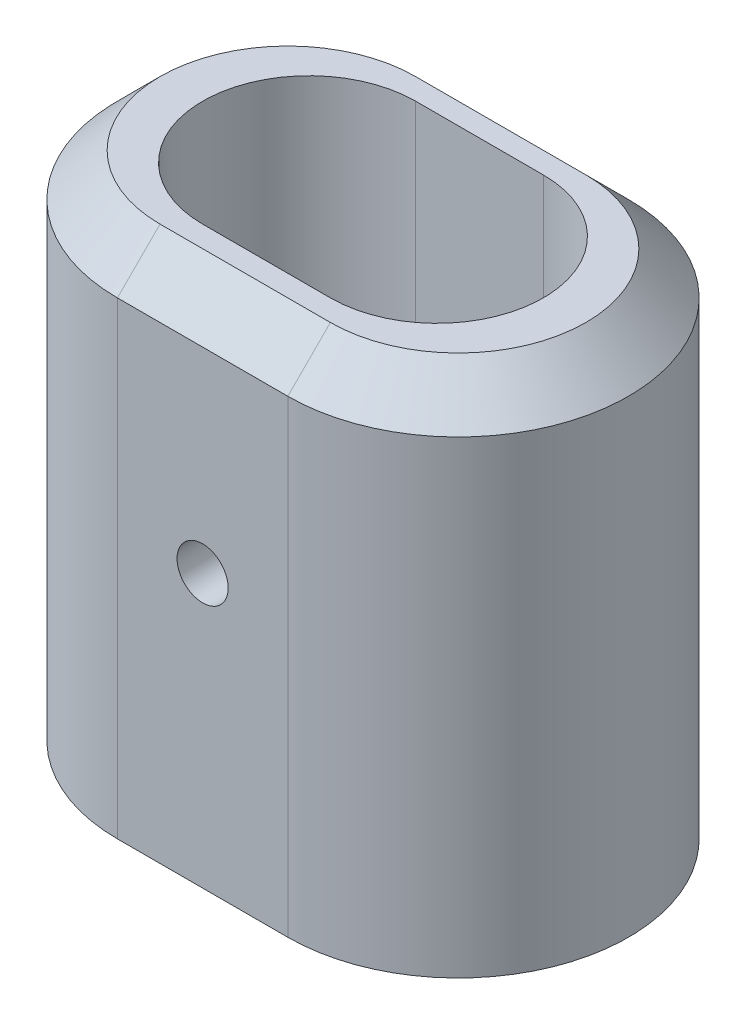
ISO-10303-21;
HEADER;
FILE_DESCRIPTION(('STEP AP214'),'2;1');
FILE_NAME('part.step','',(''),(''),'','','');
FILE_SCHEMA(('AUTOMOTIVE_DESIGN { 1 0 10303 214 1 1 1 1 }'));
ENDSEC;
DATA;
#1=APPLICATION_CONTEXT('core data for automotive mechanical design processes');
#2=APPLICATION_PROTOCOL_DEFINITION('international standard','automotive_design',2000,#1);
#3=PRODUCT_CONTEXT('',#1,'mechanical');
#4=PRODUCT('Part','Part','',(#3));
#5=PRODUCT_RELATED_PRODUCT_CATEGORY('part','',(#4));
#6=PRODUCT_DEFINITION_FORMATION('','',#4);
#7=PRODUCT_DEFINITION_CONTEXT('part definition',#1,'design');
#8=PRODUCT_DEFINITION('design','',#6,#7);
#9=PRODUCT_DEFINITION_SHAPE('','',#8);
#10=(LENGTH_UNIT() NAMED_UNIT(*) SI_UNIT(.MILLI.,.METRE.));
#11=(NAMED_UNIT(*) PLANE_ANGLE_UNIT() SI_UNIT($,.RADIAN.));
#12=(NAMED_UNIT(*) SI_UNIT($,.STERADIAN.) SOLID_ANGLE_UNIT());
#13=UNCERTAINTY_MEASURE_WITH_UNIT(LENGTH_MEASURE(1.E-05),#10,'distance_accuracy_value','');
#14=(GEOMETRIC_REPRESENTATION_CONTEXT(3) GLOBAL_UNCERTAINTY_ASSIGNED_CONTEXT((#13)) GLOBAL_UNIT_ASSIGNED_CONTEXT((#10,
#11,#12)) REPRESENTATION_CONTEXT('',''));
#15=CARTESIAN_POINT('',(0.,0.,0.));
#16=DIRECTION('',(0.,0.,1.));
#17=DIRECTION('',(1.,0.,0.));
#18=AXIS2_PLACEMENT_3D('',#15,#16,#17);
#19=CARTESIAN_POINT('',(10.,60.,0.));
#20=DIRECTION('',(0.,-1.,0.));
#21=DIRECTION('',(0.,0.,-1.));
#22=AXIS2_PLACEMENT_3D('',#19,#20,#21);
#23=PLANE('',#22);
#24=DIRECTION('',(1.,0.,0.));
#25=VECTOR('',#24,1.);
#26=CARTESIAN_POINT('',(10.,60.,15.));
#27=LINE('',#26,#25);
#28=CARTESIAN_POINT('',(-10.,60.,15.));
#29=VERTEX_POINT('',#28);
#30=CARTESIAN_POINT('',(10.,60.,15.));
#31=VERTEX_POINT('',#30);
#32=EDGE_CURVE('E206',#29,#31,#27,.T.);
#33=ORIENTED_EDGE('',*,*,#32,.T.);
#34=CARTESIAN_POINT('',(10.,60.,0.));
#35=DIRECTION('',(0.,-1.,0.));
#36=DIRECTION('',(0.,0.,-1.));
#37=AXIS2_PLACEMENT_3D('',#34,#35,#36);
#38=CIRCLE('',#37,15.);
#39=CARTESIAN_POINT('',(10.,60.,-15.));
#40=VERTEX_POINT('',#39);
#41=EDGE_CURVE('E212',#31,#40,#38,.F.);
#42=ORIENTED_EDGE('',*,*,#41,.T.);
#43=DIRECTION('',(-1.,0.,0.));
#44=VECTOR('',#43,1.);
#45=CARTESIAN_POINT('',(10.,60.,-15.));
#46=LINE('',#45,#44);
#47=CARTESIAN_POINT('',(-10.,60.,-15.));
#48=VERTEX_POINT('',#47);
#49=EDGE_CURVE('E209',#40,#48,#46,.T.);
#50=ORIENTED_EDGE('',*,*,#49,.T.);
#51=CARTESIAN_POINT('',(-10.,60.,0.));
#52=DIRECTION('',(0.,-1.,0.));
#53=DIRECTION('',(0.,0.,-1.));
#54=AXIS2_PLACEMENT_3D('',#51,#52,#53);
#55=CIRCLE('',#54,15.);
#56=EDGE_CURVE('E203',#48,#29,#55,.F.);
#57=ORIENTED_EDGE('',*,*,#56,.T.);
#58=EDGE_LOOP('',(#33,#42,#50,#57));
#59=FACE_BOUND('',#58,.T.);
#60=CARTESIAN_POINT('',(-7.5,60.,0.));
#61=DIRECTION('',(0.,1.,0.));
#62=DIRECTION('',(0.,0.,1.));
#63=AXIS2_PLACEMENT_3D('',#60,#61,#62);
#64=CIRCLE('',#63,12.5);
#65=CARTESIAN_POINT('',(-7.5,60.,-12.5));
#66=VERTEX_POINT('',#65);
#67=CARTESIAN_POINT('',(-7.5,60.,12.5));
#68=VERTEX_POINT('',#67);
#69=EDGE_CURVE('E121',#66,#68,#64,.T.);
#70=ORIENTED_EDGE('',*,*,#69,.F.);
#71=DIRECTION('',(-1.,0.,0.));
#72=VECTOR('',#71,1.);
#73=CARTESIAN_POINT('',(-7.5,60.,-12.5));
#74=LINE('',#73,#72);
#75=CARTESIAN_POINT('',(7.5,60.,-12.5));
#76=VERTEX_POINT('',#75);
#77=EDGE_CURVE('E150',#76,#66,#74,.T.);
#78=ORIENTED_EDGE('',*,*,#77,.F.);
#79=CARTESIAN_POINT('',(7.5,60.,0.));
#80=DIRECTION('',(0.,1.,0.));
#81=DIRECTION('',(0.,0.,-1.));
#82=AXIS2_PLACEMENT_3D('',#79,#80,#81);
#83=CIRCLE('',#82,12.5);
#84=CARTESIAN_POINT('',(7.5,60.,12.5));
#85=VERTEX_POINT('',#84);
#86=EDGE_CURVE('E146',#85,#76,#83,.T.);
#87=ORIENTED_EDGE('',*,*,#86,.F.);
#88=DIRECTION('',(1.,0.,0.));
#89=VECTOR('',#88,1.);
#90=CARTESIAN_POINT('',(-7.5,60.,12.5));
#91=LINE('',#90,#89);
#92=EDGE_CURVE('E132',#68,#85,#91,.T.);
#93=ORIENTED_EDGE('',*,*,#92,.F.);
#94=EDGE_LOOP('',(#70,#78,#87,#93));
#95=FACE_BOUND('',#94,.T.);
#96=ADVANCED_FACE('F41',(#59,#95),#23,.F.);
#97=CARTESIAN_POINT('',(10.,0.,0.));
#98=DIRECTION('',(0.,-1.,0.));
#99=DIRECTION('',(0.,0.,-1.));
#100=AXIS2_PLACEMENT_3D('',#97,#98,#99);
#101=PLANE('',#100);
#102=CARTESIAN_POINT('',(10.,0.,0.));
#103=DIRECTION('',(0.,1.,0.));
#104=DIRECTION('',(0.,0.,-1.));
#105=AXIS2_PLACEMENT_3D('',#102,#103,#104);
#106=CIRCLE('',#105,20.);
#107=CARTESIAN_POINT('',(10.,0.,20.));
#108=VERTEX_POINT('',#107);
#109=CARTESIAN_POINT('',(10.,0.,-20.));
#110=VERTEX_POINT('',#109);
#111=EDGE_CURVE('E141',#108,#110,#106,.T.);
#112=ORIENTED_EDGE('',*,*,#111,.F.);
#113=DIRECTION('',(1.,0.,0.));
#114=VECTOR('',#113,1.);
#115=CARTESIAN_POINT('',(10.,0.,20.));
#116=LINE('',#115,#114);
#117=CARTESIAN_POINT('',(-10.,0.,20.));
#118=VERTEX_POINT('',#117);
#119=EDGE_CURVE('E187',#118,#108,#116,.T.);
#120=ORIENTED_EDGE('',*,*,#119,.F.);
#121=CARTESIAN_POINT('',(-10.,0.,0.));
#122=DIRECTION('',(0.,1.,0.));
#123=DIRECTION('',(0.,0.,1.));
#124=AXIS2_PLACEMENT_3D('',#121,#122,#123);
#125=CIRCLE('',#124,20.);
#126=CARTESIAN_POINT('',(-10.,0.,-20.));
#127=VERTEX_POINT('',#126);
#128=EDGE_CURVE('E183',#127,#118,#125,.T.);
#129=ORIENTED_EDGE('',*,*,#128,.F.);
#130=DIRECTION('',(-1.,0.,0.));
#131=VECTOR('',#130,1.);
#132=CARTESIAN_POINT('',(-10.,0.,-20.));
#133=LINE('',#132,#131);
#134=EDGE_CURVE('E179',#110,#127,#133,.T.);
#135=ORIENTED_EDGE('',*,*,#134,.F.);
#136=EDGE_LOOP('',(#112,#120,#129,#135));
#137=FACE_BOUND('',#136,.T.);
#138=DIRECTION('',(-1.,0.,0.));
#139=VECTOR('',#138,1.);
#140=CARTESIAN_POINT('',(-7.5,0.,-12.5));
#141=LINE('',#140,#139);
#142=CARTESIAN_POINT('',(7.5,0.,-12.5));
#143=VERTEX_POINT('',#142);
#144=CARTESIAN_POINT('',(-7.5,0.,-12.5));
#145=VERTEX_POINT('',#144);
#146=EDGE_CURVE('E133',#143,#145,#141,.T.);
#147=ORIENTED_EDGE('',*,*,#146,.T.);
#148=CARTESIAN_POINT('',(-7.5,0.,0.));
#149=DIRECTION('',(0.,1.,0.));
#150=DIRECTION('',(0.,0.,1.));
#151=AXIS2_PLACEMENT_3D('',#148,#149,#150);
#152=CIRCLE('',#151,12.5);
#153=CARTESIAN_POINT('',(-7.5,0.,12.5));
#154=VERTEX_POINT('',#153);
#155=EDGE_CURVE('E156',#145,#154,#152,.T.);
#156=ORIENTED_EDGE('',*,*,#155,.T.);
#157=DIRECTION('',(1.,0.,0.));
#158=VECTOR('',#157,1.);
#159=CARTESIAN_POINT('',(-7.5,0.,12.5));
#160=LINE('',#159,#158);
#161=CARTESIAN_POINT('',(7.5,0.,12.5));
#162=VERTEX_POINT('',#161);
#163=EDGE_CURVE('E139',#154,#162,#160,.T.);
#164=ORIENTED_EDGE('',*,*,#163,.T.);
#165=CARTESIAN_POINT('',(7.5,0.,0.));
#166=DIRECTION('',(0.,1.,0.));
#167=DIRECTION('',(0.,0.,-1.));
#168=AXIS2_PLACEMENT_3D('',#165,#166,#167);
#169=CIRCLE('',#168,12.5);
#170=EDGE_CURVE('E162',#162,#143,#169,.T.);
#171=ORIENTED_EDGE('',*,*,#170,.T.);
#172=EDGE_LOOP('',(#147,#156,#164,#171));
#173=FACE_BOUND('',#172,.T.);
#174=ADVANCED_FACE('F263',(#137,#173),#101,.T.);
#175=CARTESIAN_POINT('',(10.,60.,0.));
#176=DIRECTION('',(0.,-1.,0.));
#177=DIRECTION('',(0.,0.,-1.));
#178=AXIS2_PLACEMENT_3D('',#175,#176,#177);
#179=CYLINDRICAL_SURFACE('',#178,20.);
#180=DIRECTION('',(0.,-1.,0.));
#181=VECTOR('',#180,1.);
#182=CARTESIAN_POINT('',(10.,60.,-20.));
#183=LINE('',#182,#181);
#184=CARTESIAN_POINT('',(10.,55.,-20.));
#185=VERTEX_POINT('',#184);
#186=EDGE_CURVE('E200',#185,#110,#183,.T.);
#187=ORIENTED_EDGE('',*,*,#186,.F.);
#188=CARTESIAN_POINT('',(10.,55.,0.));
#189=DIRECTION('',(0.,-1.,0.));
#190=DIRECTION('',(0.,0.,-1.));
#191=AXIS2_PLACEMENT_3D('',#188,#189,#190);
#192=CIRCLE('',#191,20.);
#193=CARTESIAN_POINT('',(10.,55.,20.));
#194=VERTEX_POINT('',#193);
#195=EDGE_CURVE('E216',#185,#194,#192,.T.);
#196=ORIENTED_EDGE('',*,*,#195,.T.);
#197=DIRECTION('',(0.,-1.,0.));
#198=VECTOR('',#197,1.);
#199=CARTESIAN_POINT('',(10.,60.,20.));
#200=LINE('',#199,#198);
#201=EDGE_CURVE('E191',#194,#108,#200,.T.);
#202=ORIENTED_EDGE('',*,*,#201,.T.);
#203=ORIENTED_EDGE('',*,*,#111,.T.);
#204=EDGE_LOOP('',(#187,#196,#202,#203));
#205=FACE_BOUND('',#204,.T.);
#206=ADVANCED_FACE('F256',(#205),#179,.T.);
#207=CARTESIAN_POINT('',(-10.,60.,-20.));
#208=DIRECTION('',(0.,0.,1.));
#209=DIRECTION('',(1.,0.,0.));
#210=AXIS2_PLACEMENT_3D('',#207,#208,#209);
#211=PLANE('',#210);
#212=CARTESIAN_POINT('',(0.,32.,-20.));
#213=DIRECTION('',(0.,0.,-1.));
#214=DIRECTION('',(-1.,0.,0.));
#215=AXIS2_PLACEMENT_3D('',#212,#213,#214);
#216=CIRCLE('',#215,3.);
#217=CARTESIAN_POINT('',(-3.,32.,-20.));
#218=VERTEX_POINT('',#217);
#219=EDGE_CURVE('E333',#218,#218,#216,.T.);
#220=ORIENTED_EDGE('',*,*,#219,.F.);
#221=EDGE_LOOP('',(#220));
#222=FACE_BOUND('',#221,.T.);
#223=DIRECTION('',(0.,-1.,0.));
#224=VECTOR('',#223,1.);
#225=CARTESIAN_POINT('',(-10.,60.,-20.));
#226=LINE('',#225,#224);
#227=CARTESIAN_POINT('',(-10.,55.,-20.));
#228=VERTEX_POINT('',#227);
#229=EDGE_CURVE('E197',#228,#127,#226,.T.);
#230=ORIENTED_EDGE('',*,*,#229,.F.);
#231=DIRECTION('',(1.,0.,0.));
#232=VECTOR('',#231,1.);
#233=CARTESIAN_POINT('',(-10.,55.,-20.));
#234=LINE('',#233,#232);
#235=EDGE_CURVE('E220',#228,#185,#234,.T.);
#236=ORIENTED_EDGE('',*,*,#235,.T.);
#237=ORIENTED_EDGE('',*,*,#186,.T.);
#238=ORIENTED_EDGE('',*,*,#134,.T.);
#239=EDGE_LOOP('',(#230,#236,#237,#238));
#240=FACE_BOUND('',#239,.T.);
#241=ADVANCED_FACE('F252',(#222,#240),#211,.F.);
#242=CARTESIAN_POINT('',(-10.,60.,0.));
#243=DIRECTION('',(0.,-1.,0.));
#244=DIRECTION('',(0.,0.,-1.));
#245=AXIS2_PLACEMENT_3D('',#242,#243,#244);
#246=CYLINDRICAL_SURFACE('',#245,20.);
#247=DIRECTION('',(0.,-1.,0.));
#248=VECTOR('',#247,1.);
#249=CARTESIAN_POINT('',(-10.,60.,20.));
#250=LINE('',#249,#248);
#251=CARTESIAN_POINT('',(-10.,55.,20.));
#252=VERTEX_POINT('',#251);
#253=EDGE_CURVE('E194',#252,#118,#250,.T.);
#254=ORIENTED_EDGE('',*,*,#253,.F.);
#255=CARTESIAN_POINT('',(-10.,55.,0.));
#256=DIRECTION('',(0.,-1.,0.));
#257=DIRECTION('',(0.,0.,-1.));
#258=AXIS2_PLACEMENT_3D('',#255,#256,#257);
#259=CIRCLE('',#258,20.);
#260=EDGE_CURVE('E11',#252,#228,#259,.T.);
#261=ORIENTED_EDGE('',*,*,#260,.T.);
#262=ORIENTED_EDGE('',*,*,#229,.T.);
#263=ORIENTED_EDGE('',*,*,#128,.T.);
#264=EDGE_LOOP('',(#254,#261,#262,#263));
#265=FACE_BOUND('',#264,.T.);
#266=ADVANCED_FACE('F276',(#265),#246,.T.);
#267=CARTESIAN_POINT('',(10.,60.,20.));
#268=DIRECTION('',(0.,0.,-1.));
#269=DIRECTION('',(-1.,0.,0.));
#270=AXIS2_PLACEMENT_3D('',#267,#268,#269);
#271=PLANE('',#270);
#272=CARTESIAN_POINT('',(0.,32.,20.));
#273=DIRECTION('',(0.,0.,-1.));
#274=DIRECTION('',(-1.,0.,0.));
#275=AXIS2_PLACEMENT_3D('',#272,#273,#274);
#276=CIRCLE('',#275,3.);
#277=CARTESIAN_POINT('',(-3.,32.,20.));
#278=VERTEX_POINT('',#277);
#279=EDGE_CURVE('E328',#278,#278,#276,.T.);
#280=ORIENTED_EDGE('',*,*,#279,.T.);
#281=EDGE_LOOP('',(#280));
#282=FACE_BOUND('',#281,.T.);
#283=ORIENTED_EDGE('',*,*,#201,.F.);
#284=DIRECTION('',(-1.,0.,0.));
#285=VECTOR('',#284,1.);
#286=CARTESIAN_POINT('',(10.,55.,20.));
#287=LINE('',#286,#285);
#288=EDGE_CURVE('E52',#194,#252,#287,.T.);
#289=ORIENTED_EDGE('',*,*,#288,.T.);
#290=ORIENTED_EDGE('',*,*,#253,.T.);
#291=ORIENTED_EDGE('',*,*,#119,.T.);
#292=EDGE_LOOP('',(#283,#289,#290,#291));
#293=FACE_BOUND('',#292,.T.);
#294=ADVANCED_FACE('F273',(#282,#293),#271,.F.);
#295=CARTESIAN_POINT('',(-7.5,60.,0.));
#296=DIRECTION('',(0.,-1.,0.));
#297=DIRECTION('',(0.,0.,-1.));
#298=AXIS2_PLACEMENT_3D('',#295,#296,#297);
#299=CYLINDRICAL_SURFACE('',#298,12.5);
#300=ORIENTED_EDGE('',*,*,#155,.F.);
#301=DIRECTION('',(0.,-1.,0.));
#302=VECTOR('',#301,1.);
#303=CARTESIAN_POINT('',(-7.5,60.,-12.5));
#304=LINE('',#303,#302);
#305=EDGE_CURVE('E127',#66,#145,#304,.T.);
#306=ORIENTED_EDGE('',*,*,#305,.F.);
#307=ORIENTED_EDGE('',*,*,#69,.T.);
#308=DIRECTION('',(0.,-1.,0.));
#309=VECTOR('',#308,1.);
#310=CARTESIAN_POINT('',(-7.5,60.,12.5));
#311=LINE('',#310,#309);
#312=EDGE_CURVE('E124',#68,#154,#311,.T.);
#313=ORIENTED_EDGE('',*,*,#312,.T.);
#314=EDGE_LOOP('',(#300,#306,#307,#313));
#315=FACE_BOUND('',#314,.T.);
#316=ADVANCED_FACE('F123',(#315),#299,.F.);
#317=CARTESIAN_POINT('',(-7.5,60.,12.5));
#318=DIRECTION('',(0.,0.,-1.));
#319=DIRECTION('',(-1.,0.,0.));
#320=AXIS2_PLACEMENT_3D('',#317,#318,#319);
#321=PLANE('',#320);
#322=CARTESIAN_POINT('',(0.,32.,12.5));
#323=DIRECTION('',(0.,0.,-1.));
#324=DIRECTION('',(-1.,0.,0.));
#325=AXIS2_PLACEMENT_3D('',#322,#323,#324);
#326=CIRCLE('',#325,3.);
#327=CARTESIAN_POINT('',(-3.,32.,12.5));
#328=VERTEX_POINT('',#327);
#329=EDGE_CURVE('E229',#328,#328,#326,.T.);
#330=ORIENTED_EDGE('',*,*,#329,.F.);
#331=EDGE_LOOP('',(#330));
#332=FACE_BOUND('',#331,.T.);
#333=ORIENTED_EDGE('',*,*,#163,.F.);
#334=ORIENTED_EDGE('',*,*,#312,.F.);
#335=ORIENTED_EDGE('',*,*,#92,.T.);
#336=DIRECTION('',(0.,-1.,0.));
#337=VECTOR('',#336,1.);
#338=CARTESIAN_POINT('',(7.5,60.,12.5));
#339=LINE('',#338,#337);
#340=EDGE_CURVE('E142',#85,#162,#339,.T.);
#341=ORIENTED_EDGE('',*,*,#340,.T.);
#342=EDGE_LOOP('',(#333,#334,#335,#341));
#343=FACE_BOUND('',#342,.T.);
#344=ADVANCED_FACE('F136',(#332,#343),#321,.T.);
#345=CARTESIAN_POINT('',(7.5,60.,0.));
#346=DIRECTION('',(0.,-1.,0.));
#347=DIRECTION('',(0.,0.,-1.));
#348=AXIS2_PLACEMENT_3D('',#345,#346,#347);
#349=CYLINDRICAL_SURFACE('',#348,12.5);
#350=ORIENTED_EDGE('',*,*,#170,.F.);
#351=ORIENTED_EDGE('',*,*,#340,.F.);
#352=ORIENTED_EDGE('',*,*,#86,.T.);
#353=DIRECTION('',(0.,-1.,0.));
#354=VECTOR('',#353,1.);
#355=CARTESIAN_POINT('',(7.5,60.,-12.5));
#356=LINE('',#355,#354);
#357=EDGE_CURVE('E171',#76,#143,#356,.T.);
#358=ORIENTED_EDGE('',*,*,#357,.T.);
#359=EDGE_LOOP('',(#350,#351,#352,#358));
#360=FACE_BOUND('',#359,.T.);
#361=ADVANCED_FACE('F306',(#360),#349,.F.);
#362=CARTESIAN_POINT('',(-7.5,60.,-12.5));
#363=DIRECTION('',(0.,0.,1.));
#364=DIRECTION('',(1.,0.,0.));
#365=AXIS2_PLACEMENT_3D('',#362,#363,#364);
#366=PLANE('',#365);
#367=CARTESIAN_POINT('',(0.,32.,-12.5));
#368=DIRECTION('',(0.,0.,1.));
#369=DIRECTION('',(1.,0.,0.));
#370=AXIS2_PLACEMENT_3D('',#367,#368,#369);
#371=CIRCLE('',#370,3.);
#372=CARTESIAN_POINT('',(3.,32.,-12.5));
#373=VERTEX_POINT('',#372);
#374=EDGE_CURVE('E46',#373,#373,#371,.T.);
#375=ORIENTED_EDGE('',*,*,#374,.F.);
#376=EDGE_LOOP('',(#375));
#377=FACE_BOUND('',#376,.T.);
#378=ORIENTED_EDGE('',*,*,#146,.F.);
#379=ORIENTED_EDGE('',*,*,#357,.F.);
#380=ORIENTED_EDGE('',*,*,#77,.T.);
#381=ORIENTED_EDGE('',*,*,#305,.T.);
#382=EDGE_LOOP('',(#378,#379,#380,#381));
#383=FACE_BOUND('',#382,.T.);
#384=ADVANCED_FACE('F302',(#377,#383),#366,.T.);
#385=CARTESIAN_POINT('',(-10.,60.,0.));
#386=DIRECTION('',(0.,-1.,0.));
#387=DIRECTION('',(0.,0.,-1.));
#388=AXIS2_PLACEMENT_3D('',#385,#386,#387);
#389=CONICAL_SURFACE('',#388,15.,0.785398163397445);
#390=DIRECTION('',(0.,0.70710678118655,0.707106781186545));
#391=VECTOR('',#390,1.);
#392=CARTESIAN_POINT('',(-10.,55.,-20.));
#393=LINE('',#392,#391);
#394=EDGE_CURVE('E232',#228,#48,#393,.T.);
#395=ORIENTED_EDGE('',*,*,#394,.F.);
#396=ORIENTED_EDGE('',*,*,#260,.F.);
#397=DIRECTION('',(0.,-0.70710678118655,0.707106781186545));
#398=VECTOR('',#397,1.);
#399=CARTESIAN_POINT('',(-10.,60.,15.));
#400=LINE('',#399,#398);
#401=EDGE_CURVE('E159',#29,#252,#400,.T.);
#402=ORIENTED_EDGE('',*,*,#401,.F.);
#403=ORIENTED_EDGE('',*,*,#56,.F.);
#404=EDGE_LOOP('',(#395,#396,#402,#403));
#405=FACE_BOUND('',#404,.T.);
#406=ADVANCED_FACE('F44',(#405),#389,.T.);
#407=CARTESIAN_POINT('',(10.,60.,15.));
#408=DIRECTION('',(0.,-0.707106781186545,-0.70710678118655));
#409=DIRECTION('',(1.,0.,0.));
#410=AXIS2_PLACEMENT_3D('',#407,#408,#409);
#411=PLANE('',#410);
#412=ORIENTED_EDGE('',*,*,#401,.T.);
#413=ORIENTED_EDGE('',*,*,#288,.F.);
#414=DIRECTION('',(0.,-0.70710678118655,0.707106781186545));
#415=VECTOR('',#414,1.);
#416=CARTESIAN_POINT('',(10.,60.,15.));
#417=LINE('',#416,#415);
#418=EDGE_CURVE('E228',#31,#194,#417,.T.);
#419=ORIENTED_EDGE('',*,*,#418,.F.);
#420=ORIENTED_EDGE('',*,*,#32,.F.);
#421=EDGE_LOOP('',(#412,#413,#419,#420));
#422=FACE_BOUND('',#421,.T.);
#423=ADVANCED_FACE('F240',(#422),#411,.F.);
#424=CARTESIAN_POINT('',(10.,60.,-15.));
#425=DIRECTION('',(0.,-0.707106781186545,0.70710678118655));
#426=DIRECTION('',(-1.,0.,0.));
#427=AXIS2_PLACEMENT_3D('',#424,#425,#426);
#428=PLANE('',#427);
#429=ORIENTED_EDGE('',*,*,#394,.T.);
#430=ORIENTED_EDGE('',*,*,#49,.F.);
#431=DIRECTION('',(0.,0.70710678118655,0.707106781186545));
#432=VECTOR('',#431,1.);
#433=CARTESIAN_POINT('',(10.,55.,-20.));
#434=LINE('',#433,#432);
#435=EDGE_CURVE('E225',#185,#40,#434,.T.);
#436=ORIENTED_EDGE('',*,*,#435,.F.);
#437=ORIENTED_EDGE('',*,*,#235,.F.);
#438=EDGE_LOOP('',(#429,#430,#436,#437));
#439=FACE_BOUND('',#438,.T.);
#440=ADVANCED_FACE('F249',(#439),#428,.F.);
#441=CARTESIAN_POINT('',(10.,60.,0.));
#442=DIRECTION('',(0.,-1.,0.));
#443=DIRECTION('',(0.,0.,-1.));
#444=AXIS2_PLACEMENT_3D('',#441,#442,#443);
#445=CONICAL_SURFACE('',#444,15.,0.785398163397445);
#446=ORIENTED_EDGE('',*,*,#418,.T.);
#447=ORIENTED_EDGE('',*,*,#195,.F.);
#448=ORIENTED_EDGE('',*,*,#435,.T.);
#449=ORIENTED_EDGE('',*,*,#41,.F.);
#450=EDGE_LOOP('',(#446,#447,#448,#449));
#451=FACE_BOUND('',#450,.T.);
#452=ADVANCED_FACE('F259',(#451),#445,.T.);
#453=CARTESIAN_POINT('',(0.,32.,20.));
#454=DIRECTION('',(0.,0.,-1.));
#455=DIRECTION('',(-1.,0.,0.));
#456=AXIS2_PLACEMENT_3D('',#453,#454,#455);
#457=CYLINDRICAL_SURFACE('',#456,3.);
#458=ORIENTED_EDGE('',*,*,#374,.T.);
#459=EDGE_LOOP('',(#458));
#460=FACE_BOUND('',#459,.T.);
#461=ORIENTED_EDGE('',*,*,#219,.T.);
#462=EDGE_LOOP('',(#461));
#463=FACE_BOUND('',#462,.T.);
#464=ADVANCED_FACE('F291',(#460,#463),#457,.F.);
#465=ORIENTED_EDGE('',*,*,#329,.T.);
#466=EDGE_LOOP('',(#465));
#467=FACE_BOUND('',#466,.T.);
#468=ORIENTED_EDGE('',*,*,#279,.F.);
#469=EDGE_LOOP('',(#468));
#470=FACE_BOUND('',#469,.T.);
#471=ADVANCED_FACE('F339',(#467,#470),#457,.F.);
#472=CLOSED_SHELL('',(#96,#174,#206,#241,#266,#294,#316,#344,#361,#384,#406,#423,#440,#452,#464,#471));
#473=MANIFOLD_SOLID_BREP('B2',#472);
#474=ADVANCED_BREP_SHAPE_REPRESENTATION('',(#18,#473),#14);
#475=SHAPE_DEFINITION_REPRESENTATION(#9,#474);
ENDSEC;
END-ISO-10303-21;
